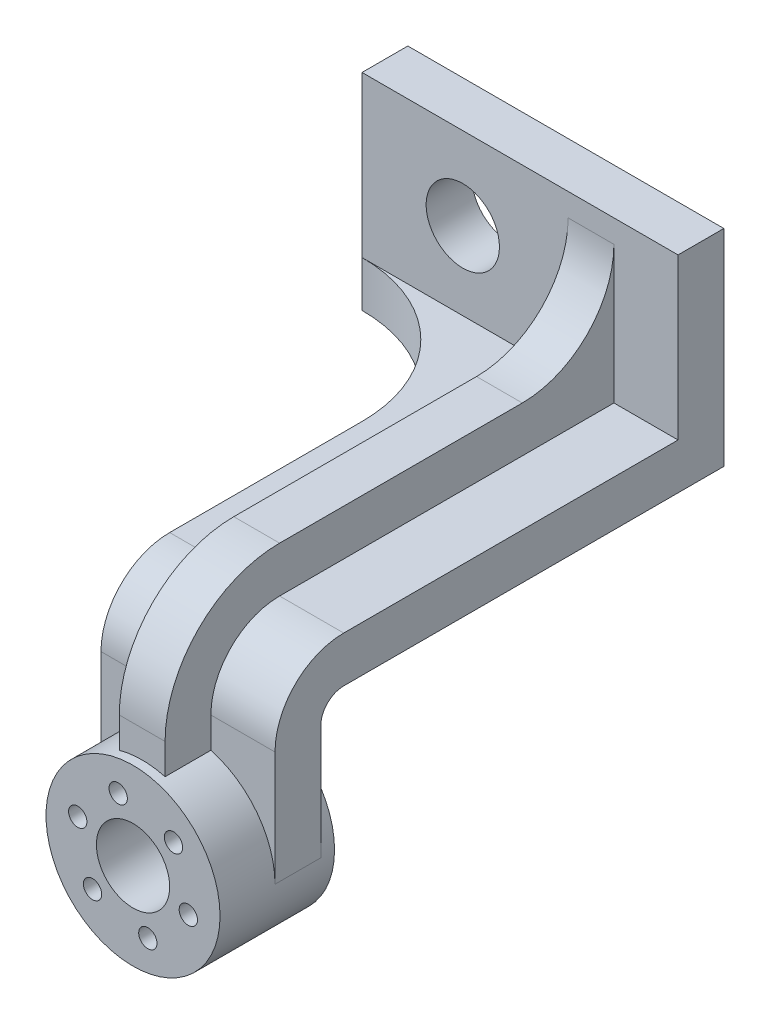
ISO-10303-21;
HEADER;
FILE_DESCRIPTION(('STEP AP214'),'2;1');
FILE_NAME('part.step','',(''),(''),'','','');
FILE_SCHEMA(('AUTOMOTIVE_DESIGN { 1 0 10303 214 1 1 1 1 }'));
ENDSEC;
DATA;
#1=APPLICATION_CONTEXT('core data for automotive mechanical design processes');
#2=APPLICATION_PROTOCOL_DEFINITION('international standard','automotive_design',2000,#1);
#3=PRODUCT_CONTEXT('',#1,'mechanical');
#4=PRODUCT('Part','Part','',(#3));
#5=PRODUCT_RELATED_PRODUCT_CATEGORY('part','',(#4));
#6=PRODUCT_DEFINITION_FORMATION('','',#4);
#7=PRODUCT_DEFINITION_CONTEXT('part definition',#1,'design');
#8=PRODUCT_DEFINITION('design','',#6,#7);
#9=PRODUCT_DEFINITION_SHAPE('','',#8);
#10=(LENGTH_UNIT() NAMED_UNIT(*) SI_UNIT(.MILLI.,.METRE.));
#11=(NAMED_UNIT(*) PLANE_ANGLE_UNIT() SI_UNIT($,.RADIAN.));
#12=(NAMED_UNIT(*) SI_UNIT($,.STERADIAN.) SOLID_ANGLE_UNIT());
#13=UNCERTAINTY_MEASURE_WITH_UNIT(LENGTH_MEASURE(1.E-05),#10,'distance_accuracy_value','');
#14=(GEOMETRIC_REPRESENTATION_CONTEXT(3) GLOBAL_UNCERTAINTY_ASSIGNED_CONTEXT((#13)) GLOBAL_UNIT_ASSIGNED_CONTEXT((#10,
#11,#12)) REPRESENTATION_CONTEXT('',''));
#15=CARTESIAN_POINT('',(0.,0.,0.));
#16=DIRECTION('',(0.,0.,1.));
#17=DIRECTION('',(1.,0.,0.));
#18=AXIS2_PLACEMENT_3D('',#15,#16,#17);
#19=CARTESIAN_POINT('',(0.,0.,0.));
#20=DIRECTION('',(0.,0.,1.));
#21=DIRECTION('',(1.,0.,0.));
#22=AXIS2_PLACEMENT_3D('',#19,#20,#21);
#23=PLANE('',#22);
#24=CARTESIAN_POINT('',(-47.,27.,0.));
#25=DIRECTION('',(0.,0.,1.));
#26=DIRECTION('',(1.,0.,0.));
#27=AXIS2_PLACEMENT_3D('',#24,#25,#26);
#28=CIRCLE('',#27,8.);
#29=CARTESIAN_POINT('',(-39.,27.,0.));
#30=VERTEX_POINT('',#29);
#31=EDGE_CURVE('E353',#30,#30,#28,.T.);
#32=ORIENTED_EDGE('',*,*,#31,.F.);
#33=EDGE_LOOP('',(#32));
#34=FACE_BOUND('',#33,.T.);
#35=DIRECTION('',(1.,0.,0.));
#36=VECTOR('',#35,1.);
#37=CARTESIAN_POINT('',(-14.,40.,0.));
#38=LINE('',#37,#36);
#39=CARTESIAN_POINT('',(-24.,40.,0.));
#40=VERTEX_POINT('',#39);
#41=CARTESIAN_POINT('',(-14.,40.,0.));
#42=VERTEX_POINT('',#41);
#43=EDGE_CURVE('E449',#40,#42,#38,.T.);
#44=ORIENTED_EDGE('',*,*,#43,.T.);
#45=DIRECTION('',(0.,1.,0.));
#46=VECTOR('',#45,1.);
#47=CARTESIAN_POINT('',(-14.,20.,0.));
#48=LINE('',#47,#46);
#49=CARTESIAN_POINT('',(-14.,10.,0.));
#50=VERTEX_POINT('',#49);
#51=EDGE_CURVE('E229',#50,#42,#48,.T.);
#52=ORIENTED_EDGE('',*,*,#51,.F.);
#53=DIRECTION('',(-1.,0.,0.));
#54=VECTOR('',#53,1.);
#55=CARTESIAN_POINT('',(0.,10.,0.));
#56=LINE('',#55,#54);
#57=CARTESIAN_POINT('',(0.,9.99999999999999,0.));
#58=VERTEX_POINT('',#57);
#59=EDGE_CURVE('E386',#58,#50,#56,.T.);
#60=ORIENTED_EDGE('',*,*,#59,.F.);
#61=DIRECTION('',(0.,1.,0.));
#62=VECTOR('',#61,1.);
#63=CARTESIAN_POINT('',(0.,0.,0.));
#64=LINE('',#63,#62);
#65=CARTESIAN_POINT('',(0.,45.,0.));
#66=VERTEX_POINT('',#65);
#67=EDGE_CURVE('E390',#58,#66,#64,.T.);
#68=ORIENTED_EDGE('',*,*,#67,.T.);
#69=DIRECTION('',(-1.,0.,0.));
#70=VECTOR('',#69,1.);
#71=CARTESIAN_POINT('',(0.,45.,0.));
#72=LINE('',#71,#70);
#73=CARTESIAN_POINT('',(-69.,45.,0.));
#74=VERTEX_POINT('',#73);
#75=EDGE_CURVE('E394',#66,#74,#72,.T.);
#76=ORIENTED_EDGE('',*,*,#75,.T.);
#77=DIRECTION('',(0.,1.,0.));
#78=VECTOR('',#77,1.);
#79=CARTESIAN_POINT('',(-69.,0.,0.));
#80=LINE('',#79,#78);
#81=CARTESIAN_POINT('',(-69.,9.99999999999999,0.));
#82=VERTEX_POINT('',#81);
#83=EDGE_CURVE('E398',#82,#74,#80,.T.);
#84=ORIENTED_EDGE('',*,*,#83,.F.);
#85=CARTESIAN_POINT('',(-24.,10.,0.));
#86=VERTEX_POINT('',#85);
#87=EDGE_CURVE('E385',#86,#82,#56,.T.);
#88=ORIENTED_EDGE('',*,*,#87,.F.);
#89=DIRECTION('',(0.,1.,0.));
#90=VECTOR('',#89,1.);
#91=CARTESIAN_POINT('',(-24.,20.,0.));
#92=LINE('',#91,#90);
#93=EDGE_CURVE('E193',#86,#40,#92,.T.);
#94=ORIENTED_EDGE('',*,*,#93,.T.);
#95=EDGE_LOOP('',(#44,#52,#60,#68,#76,#84,#88,#94));
#96=FACE_BOUND('',#95,.T.);
#97=ADVANCED_FACE('F45',(#34,#96),#23,.T.);
#98=CARTESIAN_POINT('',(0.,10.,-10.));
#99=DIRECTION('',(0.,1.,0.));
#100=DIRECTION('',(-1.,0.,0.));
#101=AXIS2_PLACEMENT_3D('',#98,#99,#100);
#102=PLANE('',#101);
#103=DIRECTION('',(-1.,0.,0.));
#104=VECTOR('',#103,1.);
#105=CARTESIAN_POINT('',(0.,10.,73.));
#106=LINE('',#105,#104);
#107=CARTESIAN_POINT('',(-38.,9.99999999999999,73.));
#108=VERTEX_POINT('',#107);
#109=CARTESIAN_POINT('',(-24.,10.,73.));
#110=VERTEX_POINT('',#109);
#111=EDGE_CURVE('E439',#108,#110,#106,.F.);
#112=ORIENTED_EDGE('',*,*,#111,.T.);
#113=DIRECTION('',(0.,0.,-1.));
#114=VECTOR('',#113,1.);
#115=CARTESIAN_POINT('',(-24.,9.99999999999999,0.));
#116=LINE('',#115,#114);
#117=EDGE_CURVE('E526',#110,#86,#116,.T.);
#118=ORIENTED_EDGE('',*,*,#117,.T.);
#119=ORIENTED_EDGE('',*,*,#87,.T.);
#120=CARTESIAN_POINT('',(-69.,9.99999999999999,31.));
#121=DIRECTION('',(0.,1.,0.));
#122=DIRECTION('',(-1.,0.,0.));
#123=AXIS2_PLACEMENT_3D('',#120,#121,#122);
#124=CIRCLE('',#123,31.);
#125=CARTESIAN_POINT('',(-38.,9.99999999999999,31.));
#126=VERTEX_POINT('',#125);
#127=EDGE_CURVE('E411',#82,#126,#124,.F.);
#128=ORIENTED_EDGE('',*,*,#127,.T.);
#129=DIRECTION('',(0.,0.,1.));
#130=VECTOR('',#129,1.);
#131=CARTESIAN_POINT('',(-38.,9.99999999999999,-10.));
#132=LINE('',#131,#130);
#133=EDGE_CURVE('E349',#126,#108,#132,.T.);
#134=ORIENTED_EDGE('',*,*,#133,.T.);
#135=EDGE_LOOP('',(#112,#118,#119,#128,#134));
#136=FACE_BOUND('',#135,.T.);
#137=ADVANCED_FACE('F542',(#136),#102,.T.);
#138=CARTESIAN_POINT('',(0.,0.,88.));
#139=DIRECTION('',(0.,0.,1.));
#140=DIRECTION('',(1.,0.,0.));
#141=AXIS2_PLACEMENT_3D('',#138,#139,#140);
#142=PLANE('',#141);
#143=CARTESIAN_POINT('',(-19.,-30.,88.));
#144=DIRECTION('',(0.,0.,1.));
#145=DIRECTION('',(1.,0.,0.));
#146=AXIS2_PLACEMENT_3D('',#143,#144,#145);
#147=CIRCLE('',#146,19.);
#148=CARTESIAN_POINT('',(-24.,-11.6696972201766,88.));
#149=VERTEX_POINT('',#148);
#150=CARTESIAN_POINT('',(-38.,-30.,88.));
#151=VERTEX_POINT('',#150);
#152=EDGE_CURVE('E283',#149,#151,#147,.T.);
#153=ORIENTED_EDGE('',*,*,#152,.F.);
#154=DIRECTION('',(0.,1.,0.));
#155=VECTOR('',#154,1.);
#156=CARTESIAN_POINT('',(-24.,-13.,88.));
#157=LINE('',#156,#155);
#158=CARTESIAN_POINT('',(-24.,-5.,88.));
#159=VERTEX_POINT('',#158);
#160=EDGE_CURVE('E519',#149,#159,#157,.T.);
#161=ORIENTED_EDGE('',*,*,#160,.T.);
#162=DIRECTION('',(-1.,0.,0.));
#163=VECTOR('',#162,1.);
#164=CARTESIAN_POINT('',(0.,-5.,88.));
#165=LINE('',#164,#163);
#166=CARTESIAN_POINT('',(-38.,-5.,88.));
#167=VERTEX_POINT('',#166);
#168=EDGE_CURVE('E430',#159,#167,#165,.T.);
#169=ORIENTED_EDGE('',*,*,#168,.T.);
#170=DIRECTION('',(0.,1.,0.));
#171=VECTOR('',#170,1.);
#172=CARTESIAN_POINT('',(-38.,0.,88.));
#173=LINE('',#172,#171);
#174=EDGE_CURVE('E333',#151,#167,#173,.T.);
#175=ORIENTED_EDGE('',*,*,#174,.F.);
#176=EDGE_LOOP('',(#153,#161,#169,#175));
#177=FACE_BOUND('',#176,.T.);
#178=ADVANCED_FACE('F466',(#177),#142,.T.);
#179=CARTESIAN_POINT('',(-19.,-30.,100.));
#180=DIRECTION('',(0.,0.,-1.));
#181=DIRECTION('',(-1.,0.,0.));
#182=AXIS2_PLACEMENT_3D('',#179,#180,#181);
#183=CYLINDRICAL_SURFACE('',#182,19.);
#184=CARTESIAN_POINT('',(-19.,-30.,75.));
#185=DIRECTION('',(0.,0.,1.));
#186=DIRECTION('',(1.,0.,0.));
#187=AXIS2_PLACEMENT_3D('',#184,#185,#186);
#188=CIRCLE('',#187,19.);
#189=CARTESIAN_POINT('',(0.,-30.,75.));
#190=VERTEX_POINT('',#189);
#191=EDGE_CURVE('E255',#190,#190,#188,.T.);
#192=ORIENTED_EDGE('',*,*,#191,.T.);
#193=EDGE_LOOP('',(#192));
#194=FACE_BOUND('',#193,.T.);
#195=CARTESIAN_POINT('',(-19.,-30.,100.));
#196=DIRECTION('',(0.,0.,1.));
#197=DIRECTION('',(1.,0.,0.));
#198=AXIS2_PLACEMENT_3D('',#195,#196,#197);
#199=CIRCLE('',#198,19.);
#200=CARTESIAN_POINT('',(0.,-30.,100.));
#201=VERTEX_POINT('',#200);
#202=EDGE_CURVE('E279',#201,#201,#199,.T.);
#203=ORIENTED_EDGE('',*,*,#202,.F.);
#204=EDGE_LOOP('',(#203));
#205=FACE_BOUND('',#204,.T.);
#206=DIRECTION('',(0.,0.,-1.));
#207=VECTOR('',#206,1.);
#208=CARTESIAN_POINT('',(-24.,-11.6696972201766,100.));
#209=LINE('',#208,#207);
#210=CARTESIAN_POINT('',(-24.,-11.6696972201766,98.));
#211=VERTEX_POINT('',#210);
#212=EDGE_CURVE('E242',#149,#211,#209,.F.);
#213=ORIENTED_EDGE('',*,*,#212,.F.);
#214=ORIENTED_EDGE('',*,*,#152,.T.);
#215=DIRECTION('',(0.,0.,1.));
#216=VECTOR('',#215,1.);
#217=CARTESIAN_POINT('',(-38.,-30.,78.));
#218=LINE('',#217,#216);
#219=CARTESIAN_POINT('',(-38.,-30.,78.));
#220=VERTEX_POINT('',#219);
#221=EDGE_CURVE('E326',#220,#151,#218,.T.);
#222=ORIENTED_EDGE('',*,*,#221,.F.);
#223=CARTESIAN_POINT('',(-19.,-30.,78.));
#224=DIRECTION('',(0.,0.,1.));
#225=DIRECTION('',(1.,0.,0.));
#226=AXIS2_PLACEMENT_3D('',#223,#224,#225);
#227=CIRCLE('',#226,19.);
#228=CARTESIAN_POINT('',(0.,-30.,78.));
#229=VERTEX_POINT('',#228);
#230=EDGE_CURVE('E317',#229,#220,#227,.T.);
#231=ORIENTED_EDGE('',*,*,#230,.F.);
#232=DIRECTION('',(0.,0.,1.));
#233=VECTOR('',#232,1.);
#234=CARTESIAN_POINT('',(0.,-30.,78.));
#235=LINE('',#234,#233);
#236=CARTESIAN_POINT('',(0.,-30.,88.));
#237=VERTEX_POINT('',#236);
#238=EDGE_CURVE('E330',#229,#237,#235,.T.);
#239=ORIENTED_EDGE('',*,*,#238,.T.);
#240=CARTESIAN_POINT('',(-14.,-11.6696972201766,88.));
#241=VERTEX_POINT('',#240);
#242=EDGE_CURVE('E318',#237,#241,#147,.T.);
#243=ORIENTED_EDGE('',*,*,#242,.T.);
#244=DIRECTION('',(0.,0.,-1.));
#245=VECTOR('',#244,1.);
#246=CARTESIAN_POINT('',(-14.,-11.6696972201766,100.));
#247=LINE('',#246,#245);
#248=CARTESIAN_POINT('',(-14.,-11.6696972201766,98.));
#249=VERTEX_POINT('',#248);
#250=EDGE_CURVE('E238',#241,#249,#247,.F.);
#251=ORIENTED_EDGE('',*,*,#250,.T.);
#252=CARTESIAN_POINT('',(-19.,-30.,98.));
#253=DIRECTION('',(0.,0.,1.));
#254=DIRECTION('',(1.,0.,0.));
#255=AXIS2_PLACEMENT_3D('',#252,#253,#254);
#256=CIRCLE('',#255,19.);
#257=EDGE_CURVE('E446',#249,#211,#256,.T.);
#258=ORIENTED_EDGE('',*,*,#257,.T.);
#259=EDGE_LOOP('',(#213,#214,#222,#231,#239,#243,#251,#258));
#260=FACE_BOUND('',#259,.T.);
#261=ADVANCED_FACE('F464',(#194,#205,#260),#183,.T.);
#262=CARTESIAN_POINT('',(0.,-5.,73.));
#263=DIRECTION('',(-1.,0.,0.));
#264=DIRECTION('',(0.,-1.,0.));
#265=AXIS2_PLACEMENT_3D('',#262,#263,#264);
#266=CYLINDRICAL_SURFACE('',#265,15.);
#267=ORIENTED_EDGE('',*,*,#168,.F.);
#268=CARTESIAN_POINT('',(-24.,-5.,73.));
#269=DIRECTION('',(-1.,0.,0.));
#270=DIRECTION('',(0.,0.,-1.));
#271=AXIS2_PLACEMENT_3D('',#268,#269,#270);
#272=CIRCLE('',#271,15.);
#273=EDGE_CURVE('E521',#159,#110,#272,.T.);
#274=ORIENTED_EDGE('',*,*,#273,.T.);
#275=ORIENTED_EDGE('',*,*,#111,.F.);
#276=CARTESIAN_POINT('',(-38.,-5.,73.));
#277=DIRECTION('',(1.,0.,0.));
#278=DIRECTION('',(0.,0.,-1.));
#279=AXIS2_PLACEMENT_3D('',#276,#277,#278);
#280=CIRCLE('',#279,15.);
#281=EDGE_CURVE('E435',#167,#108,#280,.F.);
#282=ORIENTED_EDGE('',*,*,#281,.F.);
#283=EDGE_LOOP('',(#267,#274,#275,#282));
#284=FACE_BOUND('',#283,.T.);
#285=ADVANCED_FACE('F573',(#284),#266,.T.);
#286=CARTESIAN_POINT('',(0.,0.,-10.));
#287=DIRECTION('',(0.,1.,0.));
#288=DIRECTION('',(0.,0.,1.));
#289=AXIS2_PLACEMENT_3D('',#286,#287,#288);
#290=PLANE('',#289);
#291=DIRECTION('',(0.,0.,1.));
#292=VECTOR('',#291,1.);
#293=CARTESIAN_POINT('',(0.,0.,-10.));
#294=LINE('',#293,#292);
#295=CARTESIAN_POINT('',(0.,0.,-10.));
#296=VERTEX_POINT('',#295);
#297=CARTESIAN_POINT('',(0.,0.,73.));
#298=VERTEX_POINT('',#297);
#299=EDGE_CURVE('E358',#296,#298,#294,.T.);
#300=ORIENTED_EDGE('',*,*,#299,.T.);
#301=DIRECTION('',(1.,0.,0.));
#302=VECTOR('',#301,1.);
#303=CARTESIAN_POINT('',(-38.,0.,73.));
#304=LINE('',#303,#302);
#305=CARTESIAN_POINT('',(-38.,0.,73.));
#306=VERTEX_POINT('',#305);
#307=EDGE_CURVE('E421',#298,#306,#304,.F.);
#308=ORIENTED_EDGE('',*,*,#307,.T.);
#309=DIRECTION('',(0.,0.,1.));
#310=VECTOR('',#309,1.);
#311=CARTESIAN_POINT('',(-38.,0.,-10.));
#312=LINE('',#311,#310);
#313=CARTESIAN_POINT('',(-38.,0.,31.));
#314=VERTEX_POINT('',#313);
#315=EDGE_CURVE('E348',#314,#306,#312,.T.);
#316=ORIENTED_EDGE('',*,*,#315,.F.);
#317=CARTESIAN_POINT('',(-69.,0.,31.));
#318=DIRECTION('',(0.,1.,0.));
#319=DIRECTION('',(0.,0.,1.));
#320=AXIS2_PLACEMENT_3D('',#317,#318,#319);
#321=CIRCLE('',#320,31.);
#322=CARTESIAN_POINT('',(-69.,0.,0.));
#323=VERTEX_POINT('',#322);
#324=EDGE_CURVE('E414',#314,#323,#321,.T.);
#325=ORIENTED_EDGE('',*,*,#324,.T.);
#326=DIRECTION('',(0.,0.,1.));
#327=VECTOR('',#326,1.);
#328=CARTESIAN_POINT('',(-69.,0.,-10.));
#329=LINE('',#328,#327);
#330=CARTESIAN_POINT('',(-69.,0.,-10.));
#331=VERTEX_POINT('',#330);
#332=EDGE_CURVE('E245',#331,#323,#329,.T.);
#333=ORIENTED_EDGE('',*,*,#332,.F.);
#334=DIRECTION('',(-1.,0.,0.));
#335=VECTOR('',#334,1.);
#336=CARTESIAN_POINT('',(0.,0.,-10.));
#337=LINE('',#336,#335);
#338=EDGE_CURVE('E344',#296,#331,#337,.T.);
#339=ORIENTED_EDGE('',*,*,#338,.F.);
#340=EDGE_LOOP('',(#300,#308,#316,#325,#333,#339));
#341=FACE_BOUND('',#340,.T.);
#342=ADVANCED_FACE('F486',(#341),#290,.F.);
#343=CARTESIAN_POINT('',(-69.,0.,-10.));
#344=DIRECTION('',(1.,0.,0.));
#345=DIRECTION('',(0.,0.,-1.));
#346=AXIS2_PLACEMENT_3D('',#343,#344,#345);
#347=PLANE('',#346);
#348=EDGE_CURVE('E370',#323,#82,#80,.T.);
#349=ORIENTED_EDGE('',*,*,#348,.T.);
#350=ORIENTED_EDGE('',*,*,#83,.T.);
#351=DIRECTION('',(0.,0.,1.));
#352=VECTOR('',#351,1.);
#353=CARTESIAN_POINT('',(-69.,45.,-10.));
#354=LINE('',#353,#352);
#355=CARTESIAN_POINT('',(-69.,45.,-10.));
#356=VERTEX_POINT('',#355);
#357=EDGE_CURVE('E402',#356,#74,#354,.T.);
#358=ORIENTED_EDGE('',*,*,#357,.F.);
#359=DIRECTION('',(0.,1.,0.));
#360=VECTOR('',#359,1.);
#361=CARTESIAN_POINT('',(-69.,0.,-10.));
#362=LINE('',#361,#360);
#363=EDGE_CURVE('E378',#331,#356,#362,.T.);
#364=ORIENTED_EDGE('',*,*,#363,.F.);
#365=ORIENTED_EDGE('',*,*,#332,.T.);
#366=EDGE_LOOP('',(#349,#350,#358,#364,#365));
#367=FACE_BOUND('',#366,.T.);
#368=ADVANCED_FACE('F554',(#367),#347,.F.);
#369=CARTESIAN_POINT('',(0.,45.,-10.));
#370=DIRECTION('',(0.,1.,0.));
#371=DIRECTION('',(-1.,0.,0.));
#372=AXIS2_PLACEMENT_3D('',#369,#370,#371);
#373=PLANE('',#372);
#374=ORIENTED_EDGE('',*,*,#75,.F.);
#375=DIRECTION('',(0.,0.,1.));
#376=VECTOR('',#375,1.);
#377=CARTESIAN_POINT('',(0.,45.,-10.));
#378=LINE('',#377,#376);
#379=CARTESIAN_POINT('',(0.,45.,-10.));
#380=VERTEX_POINT('',#379);
#381=EDGE_CURVE('E381',#380,#66,#378,.T.);
#382=ORIENTED_EDGE('',*,*,#381,.F.);
#383=DIRECTION('',(-1.,0.,0.));
#384=VECTOR('',#383,1.);
#385=CARTESIAN_POINT('',(0.,45.,-10.));
#386=LINE('',#385,#384);
#387=EDGE_CURVE('E374',#380,#356,#386,.T.);
#388=ORIENTED_EDGE('',*,*,#387,.T.);
#389=ORIENTED_EDGE('',*,*,#357,.T.);
#390=EDGE_LOOP('',(#374,#382,#388,#389));
#391=FACE_BOUND('',#390,.T.);
#392=ADVANCED_FACE('F497',(#391),#373,.T.);
#393=CARTESIAN_POINT('',(-47.,27.,-10.));
#394=DIRECTION('',(0.,0.,1.));
#395=DIRECTION('',(1.,0.,0.));
#396=AXIS2_PLACEMENT_3D('',#393,#394,#395);
#397=CYLINDRICAL_SURFACE('',#396,8.);
#398=CARTESIAN_POINT('',(-47.,27.,-10.));
#399=DIRECTION('',(0.,0.,1.));
#400=DIRECTION('',(1.,0.,0.));
#401=AXIS2_PLACEMENT_3D('',#398,#399,#400);
#402=CIRCLE('',#401,8.);
#403=CARTESIAN_POINT('',(-39.,27.,-10.));
#404=VERTEX_POINT('',#403);
#405=EDGE_CURVE('E365',#404,#404,#402,.T.);
#406=ORIENTED_EDGE('',*,*,#405,.F.);
#407=EDGE_LOOP('',(#406));
#408=FACE_BOUND('',#407,.T.);
#409=ORIENTED_EDGE('',*,*,#31,.T.);
#410=EDGE_LOOP('',(#409));
#411=FACE_BOUND('',#410,.T.);
#412=ADVANCED_FACE('F560',(#408,#411),#397,.F.);
#413=CARTESIAN_POINT('',(0.,0.,-10.));
#414=DIRECTION('',(1.,0.,0.));
#415=DIRECTION('',(0.,0.,-1.));
#416=AXIS2_PLACEMENT_3D('',#413,#414,#415);
#417=PLANE('',#416);
#418=DIRECTION('',(0.,0.,1.));
#419=VECTOR('',#418,1.);
#420=CARTESIAN_POINT('',(0.,9.99999999999999,-10.));
#421=LINE('',#420,#419);
#422=CARTESIAN_POINT('',(0.,9.99999999999999,73.));
#423=VERTEX_POINT('',#422);
#424=EDGE_CURVE('E354',#58,#423,#421,.T.);
#425=ORIENTED_EDGE('',*,*,#424,.T.);
#426=CARTESIAN_POINT('',(0.,-5.,73.));
#427=DIRECTION('',(1.,0.,0.));
#428=DIRECTION('',(0.,0.,-1.));
#429=AXIS2_PLACEMENT_3D('',#426,#427,#428);
#430=CIRCLE('',#429,15.);
#431=CARTESIAN_POINT('',(0.,-5.,88.));
#432=VERTEX_POINT('',#431);
#433=EDGE_CURVE('E443',#423,#432,#430,.T.);
#434=ORIENTED_EDGE('',*,*,#433,.T.);
#435=DIRECTION('',(0.,1.,0.));
#436=VECTOR('',#435,1.);
#437=CARTESIAN_POINT('',(0.,0.,88.));
#438=LINE('',#437,#436);
#439=EDGE_CURVE('E340',#237,#432,#438,.T.);
#440=ORIENTED_EDGE('',*,*,#439,.F.);
#441=ORIENTED_EDGE('',*,*,#238,.F.);
#442=DIRECTION('',(0.,1.,0.));
#443=VECTOR('',#442,1.);
#444=CARTESIAN_POINT('',(0.,0.,78.));
#445=LINE('',#444,#443);
#446=CARTESIAN_POINT('',(0.,-5.,78.));
#447=VERTEX_POINT('',#446);
#448=EDGE_CURVE('E322',#229,#447,#445,.T.);
#449=ORIENTED_EDGE('',*,*,#448,.T.);
#450=CARTESIAN_POINT('',(0.,-5.,73.));
#451=DIRECTION('',(1.,0.,0.));
#452=DIRECTION('',(0.,0.,-1.));
#453=AXIS2_PLACEMENT_3D('',#450,#451,#452);
#454=CIRCLE('',#453,5.);
#455=EDGE_CURVE('E424',#447,#298,#454,.F.);
#456=ORIENTED_EDGE('',*,*,#455,.T.);
#457=ORIENTED_EDGE('',*,*,#299,.F.);
#458=DIRECTION('',(0.,1.,0.));
#459=VECTOR('',#458,1.);
#460=CARTESIAN_POINT('',(0.,0.,-10.));
#461=LINE('',#460,#459);
#462=EDGE_CURVE('E369',#296,#380,#461,.T.);
#463=ORIENTED_EDGE('',*,*,#462,.T.);
#464=ORIENTED_EDGE('',*,*,#381,.T.);
#465=ORIENTED_EDGE('',*,*,#67,.F.);
#466=EDGE_LOOP('',(#425,#434,#440,#441,#449,#456,#457,#463,#464,#465));
#467=FACE_BOUND('',#466,.T.);
#468=ADVANCED_FACE('F482',(#467),#417,.T.);
#469=CARTESIAN_POINT('',(0.,0.,-10.));
#470=DIRECTION('',(0.,0.,1.));
#471=DIRECTION('',(1.,0.,0.));
#472=AXIS2_PLACEMENT_3D('',#469,#470,#471);
#473=PLANE('',#472);
#474=ORIENTED_EDGE('',*,*,#338,.T.);
#475=ORIENTED_EDGE('',*,*,#363,.T.);
#476=ORIENTED_EDGE('',*,*,#387,.F.);
#477=ORIENTED_EDGE('',*,*,#462,.F.);
#478=EDGE_LOOP('',(#474,#475,#476,#477));
#479=FACE_BOUND('',#478,.T.);
#480=ORIENTED_EDGE('',*,*,#405,.T.);
#481=EDGE_LOOP('',(#480));
#482=FACE_BOUND('',#481,.T.);
#483=ADVANCED_FACE('F490',(#479,#482),#473,.F.);
#484=CARTESIAN_POINT('',(-38.,0.,-10.));
#485=DIRECTION('',(1.,0.,0.));
#486=DIRECTION('',(0.,0.,-1.));
#487=AXIS2_PLACEMENT_3D('',#484,#485,#486);
#488=PLANE('',#487);
#489=ORIENTED_EDGE('',*,*,#174,.T.);
#490=ORIENTED_EDGE('',*,*,#281,.T.);
#491=ORIENTED_EDGE('',*,*,#133,.F.);
#492=DIRECTION('',(0.,1.,0.));
#493=VECTOR('',#492,1.);
#494=CARTESIAN_POINT('',(-38.,0.,31.));
#495=LINE('',#494,#493);
#496=EDGE_CURVE('E406',#126,#314,#495,.F.);
#497=ORIENTED_EDGE('',*,*,#496,.T.);
#498=ORIENTED_EDGE('',*,*,#315,.T.);
#499=CARTESIAN_POINT('',(-38.,-5.,73.));
#500=DIRECTION('',(1.,0.,0.));
#501=DIRECTION('',(0.,0.,-1.));
#502=AXIS2_PLACEMENT_3D('',#499,#500,#501);
#503=CIRCLE('',#502,5.);
#504=CARTESIAN_POINT('',(-38.,-5.,78.));
#505=VERTEX_POINT('',#504);
#506=EDGE_CURVE('E427',#306,#505,#503,.T.);
#507=ORIENTED_EDGE('',*,*,#506,.T.);
#508=DIRECTION('',(0.,-1.,0.));
#509=VECTOR('',#508,1.);
#510=CARTESIAN_POINT('',(-38.,0.,78.));
#511=LINE('',#510,#509);
#512=EDGE_CURVE('E314',#505,#220,#511,.T.);
#513=ORIENTED_EDGE('',*,*,#512,.T.);
#514=ORIENTED_EDGE('',*,*,#221,.T.);
#515=EDGE_LOOP('',(#489,#490,#491,#497,#498,#507,#513,#514));
#516=FACE_BOUND('',#515,.T.);
#517=ADVANCED_FACE('F470',(#516),#488,.F.);
#518=DIRECTION('',(0.,0.,-1.));
#519=VECTOR('',#518,1.);
#520=CARTESIAN_POINT('',(-14.,9.99999999999999,0.));
#521=LINE('',#520,#519);
#522=CARTESIAN_POINT('',(-14.,10.,73.));
#523=VERTEX_POINT('',#522);
#524=EDGE_CURVE('E225',#523,#50,#521,.T.);
#525=ORIENTED_EDGE('',*,*,#524,.F.);
#526=EDGE_CURVE('E438',#523,#423,#106,.F.);
#527=ORIENTED_EDGE('',*,*,#526,.T.);
#528=ORIENTED_EDGE('',*,*,#424,.F.);
#529=ORIENTED_EDGE('',*,*,#59,.T.);
#530=EDGE_LOOP('',(#525,#527,#528,#529));
#531=FACE_BOUND('',#530,.T.);
#532=ADVANCED_FACE('F503',(#531),#102,.T.);
#533=DIRECTION('',(0.,1.,0.));
#534=VECTOR('',#533,1.);
#535=CARTESIAN_POINT('',(-14.,-13.,88.));
#536=LINE('',#535,#534);
#537=CARTESIAN_POINT('',(-14.,-5.,88.));
#538=VERTEX_POINT('',#537);
#539=EDGE_CURVE('E217',#241,#538,#536,.T.);
#540=ORIENTED_EDGE('',*,*,#539,.F.);
#541=ORIENTED_EDGE('',*,*,#242,.F.);
#542=ORIENTED_EDGE('',*,*,#439,.T.);
#543=EDGE_CURVE('E431',#432,#538,#165,.T.);
#544=ORIENTED_EDGE('',*,*,#543,.T.);
#545=EDGE_LOOP('',(#540,#541,#542,#544));
#546=FACE_BOUND('',#545,.T.);
#547=ADVANCED_FACE('F511',(#546),#142,.T.);
#548=CARTESIAN_POINT('',(-19.,-30.,78.));
#549=DIRECTION('',(0.,0.,1.));
#550=DIRECTION('',(1.,0.,0.));
#551=AXIS2_PLACEMENT_3D('',#548,#549,#550);
#552=PLANE('',#551);
#553=ORIENTED_EDGE('',*,*,#512,.F.);
#554=DIRECTION('',(1.,0.,0.));
#555=VECTOR('',#554,1.);
#556=CARTESIAN_POINT('',(0.,-5.,78.));
#557=LINE('',#556,#555);
#558=EDGE_CURVE('E417',#505,#447,#557,.T.);
#559=ORIENTED_EDGE('',*,*,#558,.T.);
#560=ORIENTED_EDGE('',*,*,#448,.F.);
#561=ORIENTED_EDGE('',*,*,#230,.T.);
#562=EDGE_LOOP('',(#553,#559,#560,#561));
#563=FACE_BOUND('',#562,.T.);
#564=ADVANCED_FACE('F475',(#563),#552,.F.);
#565=CARTESIAN_POINT('',(-19.,-30.,100.));
#566=DIRECTION('',(0.,0.,-1.));
#567=DIRECTION('',(-1.,0.,0.));
#568=AXIS2_PLACEMENT_3D('',#565,#566,#567);
#569=CYLINDRICAL_SURFACE('',#568,8.);
#570=CARTESIAN_POINT('',(-19.,-30.,100.));
#571=DIRECTION('',(0.,0.,1.));
#572=DIRECTION('',(1.,0.,0.));
#573=AXIS2_PLACEMENT_3D('',#570,#571,#572);
#574=CIRCLE('',#573,8.);
#575=CARTESIAN_POINT('',(-11.,-30.,100.));
#576=VERTEX_POINT('',#575);
#577=EDGE_CURVE('E275',#576,#576,#574,.T.);
#578=ORIENTED_EDGE('',*,*,#577,.T.);
#579=EDGE_LOOP('',(#578));
#580=FACE_BOUND('',#579,.T.);
#581=CARTESIAN_POINT('',(-19.,-30.,75.));
#582=DIRECTION('',(0.,0.,1.));
#583=DIRECTION('',(1.,0.,0.));
#584=AXIS2_PLACEMENT_3D('',#581,#582,#583);
#585=CIRCLE('',#584,8.);
#586=CARTESIAN_POINT('',(-11.,-30.,75.));
#587=VERTEX_POINT('',#586);
#588=EDGE_CURVE('E307',#587,#587,#585,.T.);
#589=ORIENTED_EDGE('',*,*,#588,.F.);
#590=EDGE_LOOP('',(#589));
#591=FACE_BOUND('',#590,.T.);
#592=ADVANCED_FACE('F601',(#580,#591),#569,.F.);
#593=CARTESIAN_POINT('',(-10.1611652351682,-21.1611652351681,100.));
#594=DIRECTION('',(0.,0.,-1.));
#595=DIRECTION('',(-1.,0.,0.));
#596=AXIS2_PLACEMENT_3D('',#593,#594,#595);
#597=CYLINDRICAL_SURFACE('',#596,2.);
#598=CARTESIAN_POINT('',(-10.1611652351682,-21.1611652351681,100.));
#599=DIRECTION('',(0.,0.,1.));
#600=DIRECTION('',(1.,0.,0.));
#601=AXIS2_PLACEMENT_3D('',#598,#599,#600);
#602=CIRCLE('',#601,2.);
#603=CARTESIAN_POINT('',(-8.1611652351682,-21.1611652351681,100.));
#604=VERTEX_POINT('',#603);
#605=EDGE_CURVE('E271',#604,#604,#602,.T.);
#606=ORIENTED_EDGE('',*,*,#605,.T.);
#607=EDGE_LOOP('',(#606));
#608=FACE_BOUND('',#607,.T.);
#609=CARTESIAN_POINT('',(-10.1611652351682,-21.1611652351681,75.));
#610=DIRECTION('',(0.,0.,1.));
#611=DIRECTION('',(1.,0.,0.));
#612=AXIS2_PLACEMENT_3D('',#609,#610,#611);
#613=CIRCLE('',#612,2.);
#614=CARTESIAN_POINT('',(-8.1611652351682,-21.1611652351681,75.));
#615=VERTEX_POINT('',#614);
#616=EDGE_CURVE('E303',#615,#615,#613,.T.);
#617=ORIENTED_EDGE('',*,*,#616,.F.);
#618=EDGE_LOOP('',(#617));
#619=FACE_BOUND('',#618,.T.);
#620=ADVANCED_FACE('F604',(#608,#619),#597,.F.);
#621=CARTESIAN_POINT('',(-6.92592717138663,-33.2352380637814,100.));
#622=DIRECTION('',(0.,0.,-1.));
#623=DIRECTION('',(-1.,0.,0.));
#624=AXIS2_PLACEMENT_3D('',#621,#622,#623);
#625=CYLINDRICAL_SURFACE('',#624,2.);
#626=CARTESIAN_POINT('',(-6.92592717138663,-33.2352380637814,100.));
#627=DIRECTION('',(0.,0.,1.));
#628=DIRECTION('',(1.,0.,0.));
#629=AXIS2_PLACEMENT_3D('',#626,#627,#628);
#630=CIRCLE('',#629,2.);
#631=CARTESIAN_POINT('',(-4.92592717138662,-33.2352380637814,100.));
#632=VERTEX_POINT('',#631);
#633=EDGE_CURVE('E267',#632,#632,#630,.T.);
#634=ORIENTED_EDGE('',*,*,#633,.T.);
#635=EDGE_LOOP('',(#634));
#636=FACE_BOUND('',#635,.T.);
#637=CARTESIAN_POINT('',(-6.92592717138663,-33.2352380637814,75.));
#638=DIRECTION('',(0.,0.,1.));
#639=DIRECTION('',(1.,0.,0.));
#640=AXIS2_PLACEMENT_3D('',#637,#638,#639);
#641=CIRCLE('',#640,2.);
#642=CARTESIAN_POINT('',(-4.92592717138662,-33.2352380637814,75.));
#643=VERTEX_POINT('',#642);
#644=EDGE_CURVE('E299',#643,#643,#641,.T.);
#645=ORIENTED_EDGE('',*,*,#644,.F.);
#646=EDGE_LOOP('',(#645));
#647=FACE_BOUND('',#646,.T.);
#648=ADVANCED_FACE('F608',(#636,#647),#625,.F.);
#649=CARTESIAN_POINT('',(-15.7647619362184,-42.0740728286133,100.));
#650=DIRECTION('',(0.,0.,-1.));
#651=DIRECTION('',(-1.,0.,0.));
#652=AXIS2_PLACEMENT_3D('',#649,#650,#651);
#653=CYLINDRICAL_SURFACE('',#652,2.);
#654=CARTESIAN_POINT('',(-15.7647619362184,-42.0740728286133,100.));
#655=DIRECTION('',(0.,0.,1.));
#656=DIRECTION('',(1.,0.,0.));
#657=AXIS2_PLACEMENT_3D('',#654,#655,#656);
#658=CIRCLE('',#657,2.);
#659=CARTESIAN_POINT('',(-13.7647619362184,-42.0740728286133,100.));
#660=VERTEX_POINT('',#659);
#661=EDGE_CURVE('E263',#660,#660,#658,.T.);
#662=ORIENTED_EDGE('',*,*,#661,.T.);
#663=EDGE_LOOP('',(#662));
#664=FACE_BOUND('',#663,.T.);
#665=CARTESIAN_POINT('',(-15.7647619362184,-42.0740728286133,75.));
#666=DIRECTION('',(0.,0.,1.));
#667=DIRECTION('',(1.,0.,0.));
#668=AXIS2_PLACEMENT_3D('',#665,#666,#667);
#669=CIRCLE('',#668,2.);
#670=CARTESIAN_POINT('',(-13.7647619362184,-42.0740728286133,75.));
#671=VERTEX_POINT('',#670);
#672=EDGE_CURVE('E295',#671,#671,#669,.T.);
#673=ORIENTED_EDGE('',*,*,#672,.F.);
#674=EDGE_LOOP('',(#673));
#675=FACE_BOUND('',#674,.T.);
#676=ADVANCED_FACE('F612',(#664,#675),#653,.F.);
#677=CARTESIAN_POINT('',(-27.8388347648318,-38.8388347648319,100.));
#678=DIRECTION('',(0.,0.,-1.));
#679=DIRECTION('',(-1.,0.,0.));
#680=AXIS2_PLACEMENT_3D('',#677,#678,#679);
#681=CYLINDRICAL_SURFACE('',#680,2.);
#682=CARTESIAN_POINT('',(-27.8388347648318,-38.8388347648319,100.));
#683=DIRECTION('',(0.,0.,1.));
#684=DIRECTION('',(1.,0.,0.));
#685=AXIS2_PLACEMENT_3D('',#682,#683,#684);
#686=CIRCLE('',#685,2.);
#687=CARTESIAN_POINT('',(-25.8388347648318,-38.8388347648319,100.));
#688=VERTEX_POINT('',#687);
#689=EDGE_CURVE('E259',#688,#688,#686,.T.);
#690=ORIENTED_EDGE('',*,*,#689,.T.);
#691=EDGE_LOOP('',(#690));
#692=FACE_BOUND('',#691,.T.);
#693=CARTESIAN_POINT('',(-27.8388347648318,-38.8388347648319,75.));
#694=DIRECTION('',(0.,0.,1.));
#695=DIRECTION('',(1.,0.,0.));
#696=AXIS2_PLACEMENT_3D('',#693,#694,#695);
#697=CIRCLE('',#696,2.);
#698=CARTESIAN_POINT('',(-25.8388347648318,-38.8388347648319,75.));
#699=VERTEX_POINT('',#698);
#700=EDGE_CURVE('E291',#699,#699,#697,.T.);
#701=ORIENTED_EDGE('',*,*,#700,.F.);
#702=EDGE_LOOP('',(#701));
#703=FACE_BOUND('',#702,.T.);
#704=ADVANCED_FACE('F616',(#692,#703),#681,.F.);
#705=CARTESIAN_POINT('',(-31.0740728286134,-26.7647619362186,100.));
#706=DIRECTION('',(0.,0.,-1.));
#707=DIRECTION('',(-1.,0.,0.));
#708=AXIS2_PLACEMENT_3D('',#705,#706,#707);
#709=CYLINDRICAL_SURFACE('',#708,2.);
#710=CARTESIAN_POINT('',(-31.0740728286134,-26.7647619362186,100.));
#711=DIRECTION('',(0.,0.,1.));
#712=DIRECTION('',(1.,0.,0.));
#713=AXIS2_PLACEMENT_3D('',#710,#711,#712);
#714=CIRCLE('',#713,2.);
#715=CARTESIAN_POINT('',(-29.0740728286134,-26.7647619362186,100.));
#716=VERTEX_POINT('',#715);
#717=EDGE_CURVE('E254',#716,#716,#714,.T.);
#718=ORIENTED_EDGE('',*,*,#717,.T.);
#719=EDGE_LOOP('',(#718));
#720=FACE_BOUND('',#719,.T.);
#721=CARTESIAN_POINT('',(-31.0740728286134,-26.7647619362186,75.));
#722=DIRECTION('',(0.,0.,1.));
#723=DIRECTION('',(1.,0.,0.));
#724=AXIS2_PLACEMENT_3D('',#721,#722,#723);
#725=CIRCLE('',#724,2.);
#726=CARTESIAN_POINT('',(-29.0740728286134,-26.7647619362186,75.));
#727=VERTEX_POINT('',#726);
#728=EDGE_CURVE('E287',#727,#727,#725,.T.);
#729=ORIENTED_EDGE('',*,*,#728,.F.);
#730=EDGE_LOOP('',(#729));
#731=FACE_BOUND('',#730,.T.);
#732=ADVANCED_FACE('F620',(#720,#731),#709,.F.);
#733=CARTESIAN_POINT('',(-22.2352380637816,-17.9259271713867,100.));
#734=DIRECTION('',(0.,0.,-1.));
#735=DIRECTION('',(-1.,0.,0.));
#736=AXIS2_PLACEMENT_3D('',#733,#734,#735);
#737=CYLINDRICAL_SURFACE('',#736,2.);
#738=CARTESIAN_POINT('',(-22.2352380637816,-17.9259271713867,100.));
#739=DIRECTION('',(0.,0.,1.));
#740=DIRECTION('',(1.,0.,0.));
#741=AXIS2_PLACEMENT_3D('',#738,#739,#740);
#742=CIRCLE('',#741,2.);
#743=CARTESIAN_POINT('',(-20.2352380637816,-17.9259271713867,100.));
#744=VERTEX_POINT('',#743);
#745=EDGE_CURVE('E250',#744,#744,#742,.T.);
#746=ORIENTED_EDGE('',*,*,#745,.T.);
#747=EDGE_LOOP('',(#746));
#748=FACE_BOUND('',#747,.T.);
#749=CARTESIAN_POINT('',(-22.2352380637816,-17.9259271713867,75.));
#750=DIRECTION('',(0.,0.,1.));
#751=DIRECTION('',(1.,0.,0.));
#752=AXIS2_PLACEMENT_3D('',#749,#750,#751);
#753=CIRCLE('',#752,2.);
#754=CARTESIAN_POINT('',(-20.2352380637816,-17.9259271713867,75.));
#755=VERTEX_POINT('',#754);
#756=EDGE_CURVE('E249',#755,#755,#753,.T.);
#757=ORIENTED_EDGE('',*,*,#756,.F.);
#758=EDGE_LOOP('',(#757));
#759=FACE_BOUND('',#758,.T.);
#760=ADVANCED_FACE('F624',(#748,#759),#737,.F.);
#761=CARTESIAN_POINT('',(0.,0.,100.));
#762=DIRECTION('',(0.,0.,1.));
#763=DIRECTION('',(1.,0.,0.));
#764=AXIS2_PLACEMENT_3D('',#761,#762,#763);
#765=PLANE('',#764);
#766=ORIENTED_EDGE('',*,*,#745,.F.);
#767=EDGE_LOOP('',(#766));
#768=FACE_BOUND('',#767,.T.);
#769=ORIENTED_EDGE('',*,*,#717,.F.);
#770=EDGE_LOOP('',(#769));
#771=FACE_BOUND('',#770,.T.);
#772=ORIENTED_EDGE('',*,*,#689,.F.);
#773=EDGE_LOOP('',(#772));
#774=FACE_BOUND('',#773,.T.);
#775=ORIENTED_EDGE('',*,*,#661,.F.);
#776=EDGE_LOOP('',(#775));
#777=FACE_BOUND('',#776,.T.);
#778=ORIENTED_EDGE('',*,*,#633,.F.);
#779=EDGE_LOOP('',(#778));
#780=FACE_BOUND('',#779,.T.);
#781=ORIENTED_EDGE('',*,*,#605,.F.);
#782=EDGE_LOOP('',(#781));
#783=FACE_BOUND('',#782,.T.);
#784=ORIENTED_EDGE('',*,*,#577,.F.);
#785=EDGE_LOOP('',(#784));
#786=FACE_BOUND('',#785,.T.);
#787=ORIENTED_EDGE('',*,*,#202,.T.);
#788=EDGE_LOOP('',(#787));
#789=FACE_BOUND('',#788,.T.);
#790=ADVANCED_FACE('F628',(#768,#771,#774,#777,#780,#783,#786,#789),#765,.T.);
#791=CARTESIAN_POINT('',(0.,0.,75.));
#792=DIRECTION('',(0.,0.,1.));
#793=DIRECTION('',(1.,0.,0.));
#794=AXIS2_PLACEMENT_3D('',#791,#792,#793);
#795=PLANE('',#794);
#796=ORIENTED_EDGE('',*,*,#756,.T.);
#797=EDGE_LOOP('',(#796));
#798=FACE_BOUND('',#797,.T.);
#799=ORIENTED_EDGE('',*,*,#728,.T.);
#800=EDGE_LOOP('',(#799));
#801=FACE_BOUND('',#800,.T.);
#802=ORIENTED_EDGE('',*,*,#700,.T.);
#803=EDGE_LOOP('',(#802));
#804=FACE_BOUND('',#803,.T.);
#805=ORIENTED_EDGE('',*,*,#672,.T.);
#806=EDGE_LOOP('',(#805));
#807=FACE_BOUND('',#806,.T.);
#808=ORIENTED_EDGE('',*,*,#644,.T.);
#809=EDGE_LOOP('',(#808));
#810=FACE_BOUND('',#809,.T.);
#811=ORIENTED_EDGE('',*,*,#616,.T.);
#812=EDGE_LOOP('',(#811));
#813=FACE_BOUND('',#812,.T.);
#814=ORIENTED_EDGE('',*,*,#588,.T.);
#815=EDGE_LOOP('',(#814));
#816=FACE_BOUND('',#815,.T.);
#817=ORIENTED_EDGE('',*,*,#191,.F.);
#818=EDGE_LOOP('',(#817));
#819=FACE_BOUND('',#818,.T.);
#820=ADVANCED_FACE('F569',(#798,#801,#804,#807,#810,#813,#816,#819),#795,.F.);
#821=CARTESIAN_POINT('',(-69.,0.,31.));
#822=DIRECTION('',(0.,1.,0.));
#823=DIRECTION('',(0.,0.,1.));
#824=AXIS2_PLACEMENT_3D('',#821,#822,#823);
#825=CYLINDRICAL_SURFACE('',#824,31.);
#826=ORIENTED_EDGE('',*,*,#324,.F.);
#827=ORIENTED_EDGE('',*,*,#496,.F.);
#828=ORIENTED_EDGE('',*,*,#127,.F.);
#829=ORIENTED_EDGE('',*,*,#348,.F.);
#830=EDGE_LOOP('',(#826,#827,#828,#829));
#831=FACE_BOUND('',#830,.T.);
#832=ADVANCED_FACE('F566',(#831),#825,.F.);
#833=CARTESIAN_POINT('',(-19.,-5.,73.));
#834=DIRECTION('',(-1.,0.,0.));
#835=DIRECTION('',(0.,0.,1.));
#836=AXIS2_PLACEMENT_3D('',#833,#834,#835);
#837=CYLINDRICAL_SURFACE('',#836,5.);
#838=ORIENTED_EDGE('',*,*,#506,.F.);
#839=ORIENTED_EDGE('',*,*,#307,.F.);
#840=ORIENTED_EDGE('',*,*,#455,.F.);
#841=ORIENTED_EDGE('',*,*,#558,.F.);
#842=EDGE_LOOP('',(#838,#839,#840,#841));
#843=FACE_BOUND('',#842,.T.);
#844=ADVANCED_FACE('F478',(#843),#837,.F.);
#845=CARTESIAN_POINT('',(-14.,-5.,73.));
#846=DIRECTION('',(-1.,0.,0.));
#847=DIRECTION('',(0.,0.,-1.));
#848=AXIS2_PLACEMENT_3D('',#845,#846,#847);
#849=CIRCLE('',#848,15.);
#850=EDGE_CURVE('E221',#538,#523,#849,.T.);
#851=ORIENTED_EDGE('',*,*,#850,.F.);
#852=ORIENTED_EDGE('',*,*,#543,.F.);
#853=ORIENTED_EDGE('',*,*,#433,.F.);
#854=ORIENTED_EDGE('',*,*,#526,.F.);
#855=EDGE_LOOP('',(#851,#852,#853,#854));
#856=FACE_BOUND('',#855,.T.);
#857=ADVANCED_FACE('F508',(#856),#266,.T.);
#858=CARTESIAN_POINT('',(-24.,-5.,73.));
#859=DIRECTION('',(1.,0.,0.));
#860=DIRECTION('',(0.,0.,-1.));
#861=AXIS2_PLACEMENT_3D('',#858,#859,#860);
#862=PLANE('',#861);
#863=ORIENTED_EDGE('',*,*,#160,.F.);
#864=ORIENTED_EDGE('',*,*,#212,.T.);
#865=DIRECTION('',(0.,-1.,0.));
#866=VECTOR('',#865,1.);
#867=CARTESIAN_POINT('',(-24.,-5.,98.));
#868=LINE('',#867,#866);
#869=CARTESIAN_POINT('',(-24.,-5.,98.));
#870=VERTEX_POINT('',#869);
#871=EDGE_CURVE('E208',#870,#211,#868,.T.);
#872=ORIENTED_EDGE('',*,*,#871,.F.);
#873=CARTESIAN_POINT('',(-24.,-5.,73.));
#874=DIRECTION('',(1.,0.,0.));
#875=DIRECTION('',(0.,0.,-1.));
#876=AXIS2_PLACEMENT_3D('',#873,#874,#875);
#877=CIRCLE('',#876,25.);
#878=CARTESIAN_POINT('',(-24.,20.,73.));
#879=VERTEX_POINT('',#878);
#880=EDGE_CURVE('E192',#879,#870,#877,.T.);
#881=ORIENTED_EDGE('',*,*,#880,.F.);
#882=DIRECTION('',(0.,0.,1.));
#883=VECTOR('',#882,1.);
#884=CARTESIAN_POINT('',(-24.,20.,0.));
#885=LINE('',#884,#883);
#886=CARTESIAN_POINT('',(-24.,20.,20.));
#887=VERTEX_POINT('',#886);
#888=EDGE_CURVE('E183',#887,#879,#885,.T.);
#889=ORIENTED_EDGE('',*,*,#888,.F.);
#890=CARTESIAN_POINT('',(-24.,40.,20.));
#891=DIRECTION('',(1.,0.,0.));
#892=DIRECTION('',(0.,0.,-1.));
#893=AXIS2_PLACEMENT_3D('',#890,#891,#892);
#894=CIRCLE('',#893,20.);
#895=EDGE_CURVE('E11',#887,#40,#894,.T.);
#896=ORIENTED_EDGE('',*,*,#895,.T.);
#897=ORIENTED_EDGE('',*,*,#93,.F.);
#898=ORIENTED_EDGE('',*,*,#117,.F.);
#899=ORIENTED_EDGE('',*,*,#273,.F.);
#900=EDGE_LOOP('',(#863,#864,#872,#881,#889,#896,#897,#898,#899));
#901=FACE_BOUND('',#900,.T.);
#902=ADVANCED_FACE('F205',(#901),#862,.F.);
#903=CARTESIAN_POINT('',(-14.,-5.,73.));
#904=DIRECTION('',(1.,0.,0.));
#905=DIRECTION('',(0.,0.,-1.));
#906=AXIS2_PLACEMENT_3D('',#903,#904,#905);
#907=PLANE('',#906);
#908=ORIENTED_EDGE('',*,*,#250,.F.);
#909=ORIENTED_EDGE('',*,*,#539,.T.);
#910=ORIENTED_EDGE('',*,*,#850,.T.);
#911=ORIENTED_EDGE('',*,*,#524,.T.);
#912=ORIENTED_EDGE('',*,*,#51,.T.);
#913=CARTESIAN_POINT('',(-14.,40.,20.));
#914=DIRECTION('',(1.,0.,0.));
#915=DIRECTION('',(0.,0.,-1.));
#916=AXIS2_PLACEMENT_3D('',#913,#914,#915);
#917=CIRCLE('',#916,20.);
#918=CARTESIAN_POINT('',(-14.,20.,20.));
#919=VERTEX_POINT('',#918);
#920=EDGE_CURVE('E54',#42,#919,#917,.F.);
#921=ORIENTED_EDGE('',*,*,#920,.T.);
#922=DIRECTION('',(0.,0.,1.));
#923=VECTOR('',#922,1.);
#924=CARTESIAN_POINT('',(-14.,20.,0.));
#925=LINE('',#924,#923);
#926=CARTESIAN_POINT('',(-14.,20.,73.));
#927=VERTEX_POINT('',#926);
#928=EDGE_CURVE('E232',#919,#927,#925,.T.);
#929=ORIENTED_EDGE('',*,*,#928,.T.);
#930=CARTESIAN_POINT('',(-14.,-5.,73.));
#931=DIRECTION('',(1.,0.,0.));
#932=DIRECTION('',(0.,0.,-1.));
#933=AXIS2_PLACEMENT_3D('',#930,#931,#932);
#934=CIRCLE('',#933,25.);
#935=CARTESIAN_POINT('',(-14.,-5.,98.));
#936=VERTEX_POINT('',#935);
#937=EDGE_CURVE('E199',#927,#936,#934,.T.);
#938=ORIENTED_EDGE('',*,*,#937,.T.);
#939=DIRECTION('',(0.,-1.,0.));
#940=VECTOR('',#939,1.);
#941=CARTESIAN_POINT('',(-14.,-5.,98.));
#942=LINE('',#941,#940);
#943=EDGE_CURVE('E213',#936,#249,#942,.T.);
#944=ORIENTED_EDGE('',*,*,#943,.T.);
#945=EDGE_LOOP('',(#908,#909,#910,#911,#912,#921,#929,#938,#944));
#946=FACE_BOUND('',#945,.T.);
#947=ADVANCED_FACE('F505',(#946),#907,.T.);
#948=CARTESIAN_POINT('',(-24.,-5.,98.));
#949=DIRECTION('',(0.,0.,1.));
#950=DIRECTION('',(1.,0.,0.));
#951=AXIS2_PLACEMENT_3D('',#948,#949,#950);
#952=PLANE('',#951);
#953=ORIENTED_EDGE('',*,*,#257,.F.);
#954=ORIENTED_EDGE('',*,*,#943,.F.);
#955=DIRECTION('',(1.,0.,0.));
#956=VECTOR('',#955,1.);
#957=CARTESIAN_POINT('',(-24.,-5.,98.));
#958=LINE('',#957,#956);
#959=EDGE_CURVE('E201',#870,#936,#958,.T.);
#960=ORIENTED_EDGE('',*,*,#959,.F.);
#961=ORIENTED_EDGE('',*,*,#871,.T.);
#962=EDGE_LOOP('',(#953,#954,#960,#961));
#963=FACE_BOUND('',#962,.T.);
#964=ADVANCED_FACE('F517',(#963),#952,.T.);
#965=CARTESIAN_POINT('',(-24.,-5.,73.));
#966=DIRECTION('',(1.,0.,0.));
#967=DIRECTION('',(0.,0.,-1.));
#968=AXIS2_PLACEMENT_3D('',#965,#966,#967);
#969=CYLINDRICAL_SURFACE('',#968,25.);
#970=ORIENTED_EDGE('',*,*,#937,.F.);
#971=DIRECTION('',(1.,0.,0.));
#972=VECTOR('',#971,1.);
#973=CARTESIAN_POINT('',(-24.,20.,73.));
#974=LINE('',#973,#972);
#975=EDGE_CURVE('E186',#879,#927,#974,.T.);
#976=ORIENTED_EDGE('',*,*,#975,.F.);
#977=ORIENTED_EDGE('',*,*,#880,.T.);
#978=ORIENTED_EDGE('',*,*,#959,.T.);
#979=EDGE_LOOP('',(#970,#976,#977,#978));
#980=FACE_BOUND('',#979,.T.);
#981=ADVANCED_FACE('F197',(#980),#969,.T.);
#982=CARTESIAN_POINT('',(-24.,20.,0.));
#983=DIRECTION('',(0.,1.,0.));
#984=DIRECTION('',(0.,0.,1.));
#985=AXIS2_PLACEMENT_3D('',#982,#983,#984);
#986=PLANE('',#985);
#987=ORIENTED_EDGE('',*,*,#928,.F.);
#988=DIRECTION('',(1.,0.,0.));
#989=VECTOR('',#988,1.);
#990=CARTESIAN_POINT('',(-24.,20.,20.));
#991=LINE('',#990,#989);
#992=EDGE_CURVE('E61',#919,#887,#991,.F.);
#993=ORIENTED_EDGE('',*,*,#992,.T.);
#994=ORIENTED_EDGE('',*,*,#888,.T.);
#995=ORIENTED_EDGE('',*,*,#975,.T.);
#996=EDGE_LOOP('',(#987,#993,#994,#995));
#997=FACE_BOUND('',#996,.T.);
#998=ADVANCED_FACE('F185',(#997),#986,.T.);
#999=CARTESIAN_POINT('',(0.,40.,20.));
#1000=DIRECTION('',(-1.,0.,0.));
#1001=DIRECTION('',(0.,0.,1.));
#1002=AXIS2_PLACEMENT_3D('',#999,#1000,#1001);
#1003=CYLINDRICAL_SURFACE('',#1002,20.);
#1004=ORIENTED_EDGE('',*,*,#895,.F.);
#1005=ORIENTED_EDGE('',*,*,#992,.F.);
#1006=ORIENTED_EDGE('',*,*,#920,.F.);
#1007=ORIENTED_EDGE('',*,*,#43,.F.);
#1008=EDGE_LOOP('',(#1004,#1005,#1006,#1007));
#1009=FACE_BOUND('',#1008,.T.);
#1010=ADVANCED_FACE('F47',(#1009),#1003,.F.);
#1011=CLOSED_SHELL('',(#97,#137,#178,#261,#285,#342,#368,#392,#412,#468,#483,#517,#532,#547,
#564,#592,#620,#648,#676,#704,#732,#760,#790,#820,#832,#844,#857,#902,#947,#964,#981,#998,#1010));
#1012=MANIFOLD_SOLID_BREP('B2',#1011);
#1013=ADVANCED_BREP_SHAPE_REPRESENTATION('',(#18,#1012),#14);
#1014=SHAPE_DEFINITION_REPRESENTATION(#9,#1013);
ENDSEC;
END-ISO-10303-21;
